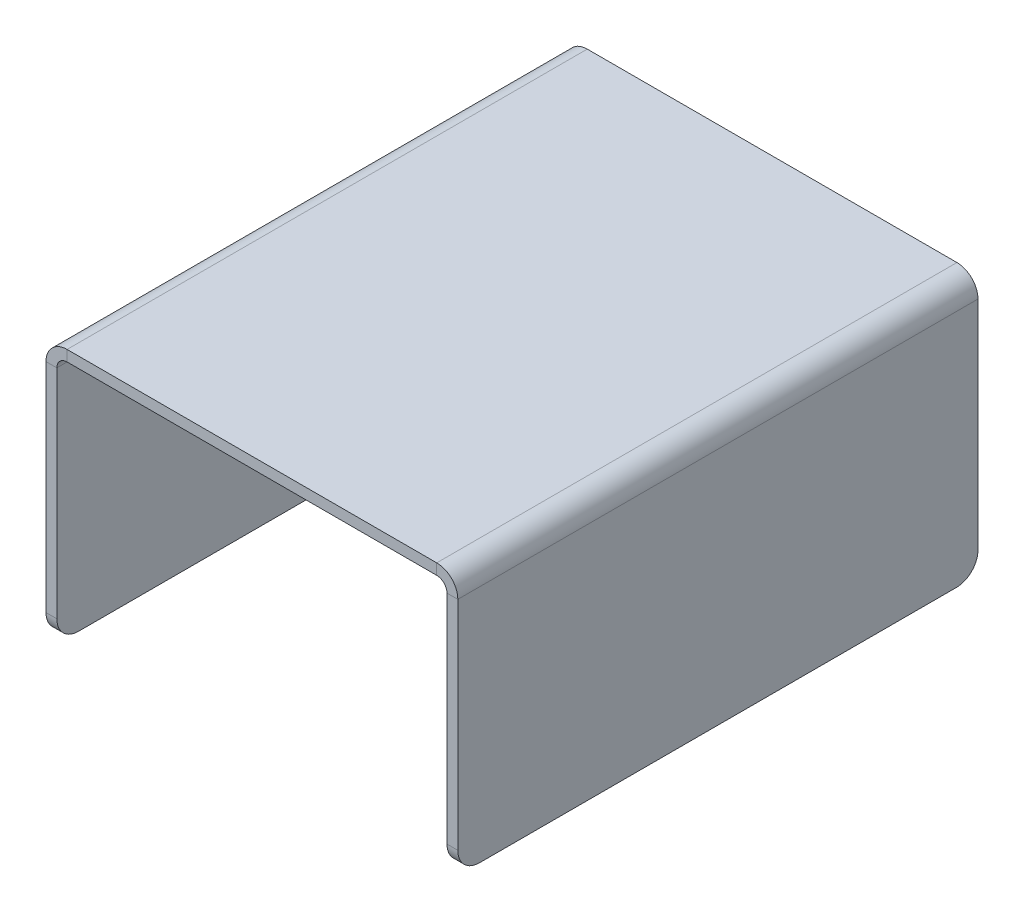
ISO-10303-21;
HEADER;
FILE_DESCRIPTION(('STEP AP214'),'2;1');
FILE_NAME('part.step','',(''),(''),'','','');
FILE_SCHEMA(('AUTOMOTIVE_DESIGN { 1 0 10303 214 1 1 1 1 }'));
ENDSEC;
DATA;
#1=APPLICATION_CONTEXT('core data for automotive mechanical design processes');
#2=APPLICATION_PROTOCOL_DEFINITION('international standard','automotive_design',2000,#1);
#3=PRODUCT_CONTEXT('',#1,'mechanical');
#4=PRODUCT('Part','Part','',(#3));
#5=PRODUCT_RELATED_PRODUCT_CATEGORY('part','',(#4));
#6=PRODUCT_DEFINITION_FORMATION('','',#4);
#7=PRODUCT_DEFINITION_CONTEXT('part definition',#1,'design');
#8=PRODUCT_DEFINITION('design','',#6,#7);
#9=PRODUCT_DEFINITION_SHAPE('','',#8);
#10=(LENGTH_UNIT() NAMED_UNIT(*) SI_UNIT(.MILLI.,.METRE.));
#11=(NAMED_UNIT(*) PLANE_ANGLE_UNIT() SI_UNIT($,.RADIAN.));
#12=(NAMED_UNIT(*) SI_UNIT($,.STERADIAN.) SOLID_ANGLE_UNIT());
#13=UNCERTAINTY_MEASURE_WITH_UNIT(LENGTH_MEASURE(1.E-05),#10,'distance_accuracy_value','');
#14=(GEOMETRIC_REPRESENTATION_CONTEXT(3) GLOBAL_UNCERTAINTY_ASSIGNED_CONTEXT((#13)) GLOBAL_UNIT_ASSIGNED_CONTEXT((#10,
#11,#12)) REPRESENTATION_CONTEXT('',''));
#15=CARTESIAN_POINT('',(0.,0.,0.));
#16=DIRECTION('',(0.,0.,1.));
#17=DIRECTION('',(1.,0.,0.));
#18=AXIS2_PLACEMENT_3D('',#15,#16,#17);
#19=CARTESIAN_POINT('',(0.,-3.175,0.));
#20=DIRECTION('',(0.,-1.,0.));
#21=DIRECTION('',(0.,0.,-1.));
#22=AXIS2_PLACEMENT_3D('',#19,#20,#21);
#23=PLANE('',#22);
#24=DIRECTION('',(1.,0.,0.));
#25=VECTOR('',#24,1.);
#26=CARTESIAN_POINT('',(-57.15,-3.175,76.2));
#27=LINE('',#26,#25);
#28=CARTESIAN_POINT('',(-54.149999904,-3.17499999999999,76.1999999999999));
#29=VERTEX_POINT('',#28);
#30=CARTESIAN_POINT('',(54.149999904,-3.175,76.2));
#31=VERTEX_POINT('',#30);
#32=EDGE_CURVE('E316',#29,#31,#27,.T.);
#33=ORIENTED_EDGE('',*,*,#32,.F.);
#34=DIRECTION('',(0.,0.,-1.));
#35=VECTOR('',#34,1.);
#36=CARTESIAN_POINT('',(-54.149999904,-3.17499999999999,-76.2));
#37=LINE('',#36,#35);
#38=CARTESIAN_POINT('',(-54.149999904,-3.17499999999999,-76.2));
#39=VERTEX_POINT('',#38);
#40=EDGE_CURVE('E234',#39,#29,#37,.F.);
#41=ORIENTED_EDGE('',*,*,#40,.F.);
#42=DIRECTION('',(-1.,0.,0.));
#43=VECTOR('',#42,1.);
#44=CARTESIAN_POINT('',(-57.15,-3.175,-76.2));
#45=LINE('',#44,#43);
#46=CARTESIAN_POINT('',(54.149999904,-3.175,-76.2));
#47=VERTEX_POINT('',#46);
#48=EDGE_CURVE('E312',#47,#39,#45,.T.);
#49=ORIENTED_EDGE('',*,*,#48,.F.);
#50=DIRECTION('',(0.,0.,1.));
#51=VECTOR('',#50,1.);
#52=CARTESIAN_POINT('',(54.149999904,-3.17499999999998,76.2));
#53=LINE('',#52,#51);
#54=EDGE_CURVE('E298',#31,#47,#53,.F.);
#55=ORIENTED_EDGE('',*,*,#54,.F.);
#56=EDGE_LOOP('',(#33,#41,#49,#55));
#57=FACE_BOUND('',#56,.T.);
#58=ADVANCED_FACE('F47',(#57),#23,.T.);
#59=CARTESIAN_POINT('',(0.,0.,0.));
#60=DIRECTION('',(0.,-1.,0.));
#61=DIRECTION('',(0.,0.,-1.));
#62=AXIS2_PLACEMENT_3D('',#59,#60,#61);
#63=PLANE('',#62);
#64=DIRECTION('',(0.,0.,-1.));
#65=VECTOR('',#64,1.);
#66=CARTESIAN_POINT('',(-54.149999904,0.,-76.2));
#67=LINE('',#66,#65);
#68=CARTESIAN_POINT('',(-54.149999904,0.,-76.2));
#69=VERTEX_POINT('',#68);
#70=CARTESIAN_POINT('',(-54.149999904,0.,76.1999999999999));
#71=VERTEX_POINT('',#70);
#72=EDGE_CURVE('E172',#69,#71,#67,.F.);
#73=ORIENTED_EDGE('',*,*,#72,.T.);
#74=DIRECTION('',(1.,0.,0.));
#75=VECTOR('',#74,1.);
#76=CARTESIAN_POINT('',(-57.15,0.,76.2));
#77=LINE('',#76,#75);
#78=CARTESIAN_POINT('',(54.149999904,0.,76.2));
#79=VERTEX_POINT('',#78);
#80=EDGE_CURVE('E317',#71,#79,#77,.T.);
#81=ORIENTED_EDGE('',*,*,#80,.T.);
#82=DIRECTION('',(0.,0.,1.));
#83=VECTOR('',#82,1.);
#84=CARTESIAN_POINT('',(54.149999904,0.,76.2));
#85=LINE('',#84,#83);
#86=CARTESIAN_POINT('',(54.149999904,0.,-76.2));
#87=VERTEX_POINT('',#86);
#88=EDGE_CURVE('E282',#79,#87,#85,.F.);
#89=ORIENTED_EDGE('',*,*,#88,.T.);
#90=DIRECTION('',(-1.,0.,0.));
#91=VECTOR('',#90,1.);
#92=CARTESIAN_POINT('',(-57.15,0.,-76.2));
#93=LINE('',#92,#91);
#94=EDGE_CURVE('E309',#87,#69,#93,.T.);
#95=ORIENTED_EDGE('',*,*,#94,.T.);
#96=EDGE_LOOP('',(#73,#81,#89,#95));
#97=FACE_BOUND('',#96,.T.);
#98=ADVANCED_FACE('F408',(#97),#63,.F.);
#99=CARTESIAN_POINT('',(-57.15,-3.175,-76.2));
#100=DIRECTION('',(0.,0.,-1.));
#101=DIRECTION('',(-1.,0.,0.));
#102=AXIS2_PLACEMENT_3D('',#99,#100,#101);
#103=PLANE('',#102);
#104=ORIENTED_EDGE('',*,*,#48,.T.);
#105=DIRECTION('',(0.,1.,0.));
#106=VECTOR('',#105,1.);
#107=CARTESIAN_POINT('',(-54.149999904,-3.17499999999999,-76.2));
#108=LINE('',#107,#106);
#109=EDGE_CURVE('E229',#39,#69,#108,.T.);
#110=ORIENTED_EDGE('',*,*,#109,.T.);
#111=ORIENTED_EDGE('',*,*,#94,.F.);
#112=DIRECTION('',(0.,1.,0.));
#113=VECTOR('',#112,1.);
#114=CARTESIAN_POINT('',(54.149999904,-3.17499999999998,-76.1999999999999));
#115=LINE('',#114,#113);
#116=EDGE_CURVE('E305',#47,#87,#115,.T.);
#117=ORIENTED_EDGE('',*,*,#116,.F.);
#118=EDGE_LOOP('',(#104,#110,#111,#117));
#119=FACE_BOUND('',#118,.T.);
#120=ADVANCED_FACE('F411',(#119),#103,.T.);
#121=CARTESIAN_POINT('',(-57.15,-3.175,76.2));
#122=DIRECTION('',(0.,0.,1.));
#123=DIRECTION('',(1.,0.,0.));
#124=AXIS2_PLACEMENT_3D('',#121,#122,#123);
#125=PLANE('',#124);
#126=DIRECTION('',(0.,1.,0.));
#127=VECTOR('',#126,1.);
#128=CARTESIAN_POINT('',(-54.149999904,-3.17499999999999,76.1999999999999));
#129=LINE('',#128,#127);
#130=EDGE_CURVE('E240',#29,#71,#129,.T.);
#131=ORIENTED_EDGE('',*,*,#130,.F.);
#132=ORIENTED_EDGE('',*,*,#32,.T.);
#133=DIRECTION('',(0.,1.,0.));
#134=VECTOR('',#133,1.);
#135=CARTESIAN_POINT('',(54.149999904,-3.17499999999998,76.2));
#136=LINE('',#135,#134);
#137=EDGE_CURVE('E290',#31,#79,#136,.T.);
#138=ORIENTED_EDGE('',*,*,#137,.T.);
#139=ORIENTED_EDGE('',*,*,#80,.F.);
#140=EDGE_LOOP('',(#131,#132,#138,#139));
#141=FACE_BOUND('',#140,.T.);
#142=ADVANCED_FACE('F406',(#141),#125,.T.);
#143=CARTESIAN_POINT('',(54.149999904,-6.17500009599999,-76.2));
#144=DIRECTION('',(0.,0.,-1.));
#145=DIRECTION('',(-1.,0.,0.));
#146=AXIS2_PLACEMENT_3D('',#143,#144,#145);
#147=PLANE('',#146);
#148=DIRECTION('',(1.,0.,0.));
#149=VECTOR('',#148,1.);
#150=CARTESIAN_POINT('',(57.15,-6.17500009599999,-76.2));
#151=LINE('',#150,#149);
#152=CARTESIAN_POINT('',(57.15,-6.17500009599998,-76.1999999999999));
#153=VERTEX_POINT('',#152);
#154=CARTESIAN_POINT('',(60.325,-6.17500009599997,-76.1999999999999));
#155=VERTEX_POINT('',#154);
#156=EDGE_CURVE('E244',#153,#155,#151,.T.);
#157=ORIENTED_EDGE('',*,*,#156,.F.);
#158=CARTESIAN_POINT('',(54.149999904,-6.17500009599999,-76.2));
#159=DIRECTION('',(0.,0.,1.));
#160=DIRECTION('',(1.,0.,0.));
#161=AXIS2_PLACEMENT_3D('',#158,#159,#160);
#162=CIRCLE('',#161,3.00000009600001);
#163=EDGE_CURVE('E294',#47,#153,#162,.F.);
#164=ORIENTED_EDGE('',*,*,#163,.F.);
#165=ORIENTED_EDGE('',*,*,#116,.T.);
#166=CARTESIAN_POINT('',(54.149999904,-6.17500009599999,-76.1999999999999));
#167=DIRECTION('',(0.,0.,1.));
#168=DIRECTION('',(1.,0.,0.));
#169=AXIS2_PLACEMENT_3D('',#166,#167,#168);
#170=CIRCLE('',#169,6.17500009600001);
#171=EDGE_CURVE('E285',#87,#155,#170,.F.);
#172=ORIENTED_EDGE('',*,*,#171,.T.);
#173=EDGE_LOOP('',(#157,#164,#165,#172));
#174=FACE_BOUND('',#173,.T.);
#175=ADVANCED_FACE('F392',(#174),#147,.T.);
#176=CARTESIAN_POINT('',(54.149999904,-6.17500009599999,76.2));
#177=DIRECTION('',(0.,0.,-1.));
#178=DIRECTION('',(-1.,0.,0.));
#179=AXIS2_PLACEMENT_3D('',#176,#177,#178);
#180=PLANE('',#179);
#181=CARTESIAN_POINT('',(54.149999904,-6.17500009599999,76.2));
#182=DIRECTION('',(0.,0.,1.));
#183=DIRECTION('',(1.,0.,0.));
#184=AXIS2_PLACEMENT_3D('',#181,#182,#183);
#185=CIRCLE('',#184,3.00000009600001);
#186=CARTESIAN_POINT('',(57.15,-6.17500009599998,76.2));
#187=VERTEX_POINT('',#186);
#188=EDGE_CURVE('E273',#187,#31,#185,.T.);
#189=ORIENTED_EDGE('',*,*,#188,.F.);
#190=DIRECTION('',(1.,0.,0.));
#191=VECTOR('',#190,1.);
#192=CARTESIAN_POINT('',(57.15,-6.17500009599998,76.2));
#193=LINE('',#192,#191);
#194=CARTESIAN_POINT('',(60.325,-6.17500009599997,76.2));
#195=VERTEX_POINT('',#194);
#196=EDGE_CURVE('E251',#187,#195,#193,.T.);
#197=ORIENTED_EDGE('',*,*,#196,.T.);
#198=CARTESIAN_POINT('',(54.149999904,-6.17500009599999,76.2));
#199=DIRECTION('',(0.,0.,1.));
#200=DIRECTION('',(1.,0.,0.));
#201=AXIS2_PLACEMENT_3D('',#198,#199,#200);
#202=CIRCLE('',#201,6.17500009600001);
#203=EDGE_CURVE('E286',#195,#79,#202,.T.);
#204=ORIENTED_EDGE('',*,*,#203,.T.);
#205=ORIENTED_EDGE('',*,*,#137,.F.);
#206=EDGE_LOOP('',(#189,#197,#204,#205));
#207=FACE_BOUND('',#206,.T.);
#208=ADVANCED_FACE('F384',(#207),#180,.F.);
#209=CARTESIAN_POINT('',(54.149999904,-6.17500009599999,76.2));
#210=DIRECTION('',(0.,0.,1.));
#211=DIRECTION('',(1.,0.,0.));
#212=AXIS2_PLACEMENT_3D('',#209,#210,#211);
#213=CYLINDRICAL_SURFACE('',#212,6.17500009600001);
#214=ORIENTED_EDGE('',*,*,#88,.F.);
#215=ORIENTED_EDGE('',*,*,#203,.F.);
#216=DIRECTION('',(0.,0.,-1.));
#217=VECTOR('',#216,1.);
#218=CARTESIAN_POINT('',(60.325,-6.17500009599997,0.));
#219=LINE('',#218,#217);
#220=EDGE_CURVE('E255',#195,#155,#219,.T.);
#221=ORIENTED_EDGE('',*,*,#220,.T.);
#222=ORIENTED_EDGE('',*,*,#171,.F.);
#223=EDGE_LOOP('',(#214,#215,#221,#222));
#224=FACE_BOUND('',#223,.T.);
#225=ADVANCED_FACE('F389',(#224),#213,.T.);
#226=CARTESIAN_POINT('',(54.149999904,-6.17500009599999,76.2));
#227=DIRECTION('',(0.,0.,1.));
#228=DIRECTION('',(1.,0.,0.));
#229=AXIS2_PLACEMENT_3D('',#226,#227,#228);
#230=CYLINDRICAL_SURFACE('',#229,3.00000009600001);
#231=ORIENTED_EDGE('',*,*,#54,.T.);
#232=ORIENTED_EDGE('',*,*,#163,.T.);
#233=DIRECTION('',(0.,0.,1.));
#234=VECTOR('',#233,1.);
#235=CARTESIAN_POINT('',(57.15,-6.17500009599999,-76.2));
#236=LINE('',#235,#234);
#237=EDGE_CURVE('E248',#153,#187,#236,.T.);
#238=ORIENTED_EDGE('',*,*,#237,.T.);
#239=ORIENTED_EDGE('',*,*,#188,.T.);
#240=EDGE_LOOP('',(#231,#232,#238,#239));
#241=FACE_BOUND('',#240,.T.);
#242=ADVANCED_FACE('F399',(#241),#230,.F.);
#243=CARTESIAN_POINT('',(60.3250000000003,-76.2,76.2));
#244=DIRECTION('',(0.,0.,-1.));
#245=DIRECTION('',(0.,1.,0.));
#246=AXIS2_PLACEMENT_3D('',#243,#244,#245);
#247=PLANE('',#246);
#248=DIRECTION('',(0.,-1.,0.));
#249=VECTOR('',#248,1.);
#250=CARTESIAN_POINT('',(57.1500000000003,-76.2,76.2));
#251=LINE('',#250,#249);
#252=CARTESIAN_POINT('',(57.1500000000002,-69.85,76.2));
#253=VERTEX_POINT('',#252);
#254=EDGE_CURVE('E262',#187,#253,#251,.T.);
#255=ORIENTED_EDGE('',*,*,#254,.T.);
#256=DIRECTION('',(-1.,0.,0.));
#257=VECTOR('',#256,1.);
#258=CARTESIAN_POINT('',(60.3250000000002,-69.85,76.2));
#259=LINE('',#258,#257);
#260=CARTESIAN_POINT('',(60.3250000000002,-69.85,76.2));
#261=VERTEX_POINT('',#260);
#262=EDGE_CURVE('E71',#253,#261,#259,.F.);
#263=ORIENTED_EDGE('',*,*,#262,.T.);
#264=DIRECTION('',(0.,-1.,0.));
#265=VECTOR('',#264,1.);
#266=CARTESIAN_POINT('',(60.3250000000003,-76.2,76.2));
#267=LINE('',#266,#265);
#268=EDGE_CURVE('E263',#195,#261,#267,.T.);
#269=ORIENTED_EDGE('',*,*,#268,.F.);
#270=ORIENTED_EDGE('',*,*,#196,.F.);
#271=EDGE_LOOP('',(#255,#263,#269,#270));
#272=FACE_BOUND('',#271,.T.);
#273=ADVANCED_FACE('F381',(#272),#247,.F.);
#274=CARTESIAN_POINT('',(60.325,-3.17499999999999,-76.2));
#275=DIRECTION('',(0.,0.,1.));
#276=DIRECTION('',(1.,0.,0.));
#277=AXIS2_PLACEMENT_3D('',#274,#275,#276);
#278=PLANE('',#277);
#279=DIRECTION('',(0.,1.,0.));
#280=VECTOR('',#279,1.);
#281=CARTESIAN_POINT('',(60.325,-3.17499999999999,-76.2));
#282=LINE('',#281,#280);
#283=CARTESIAN_POINT('',(60.3250000000002,-69.85,-76.2));
#284=VERTEX_POINT('',#283);
#285=EDGE_CURVE('E270',#284,#155,#282,.T.);
#286=ORIENTED_EDGE('',*,*,#285,.F.);
#287=DIRECTION('',(-1.,0.,0.));
#288=VECTOR('',#287,1.);
#289=CARTESIAN_POINT('',(60.3250000000002,-69.85,-76.2));
#290=LINE('',#289,#288);
#291=CARTESIAN_POINT('',(57.1500000000002,-69.85,-76.2));
#292=VERTEX_POINT('',#291);
#293=EDGE_CURVE('E11',#284,#292,#290,.T.);
#294=ORIENTED_EDGE('',*,*,#293,.T.);
#295=DIRECTION('',(0.,1.,0.));
#296=VECTOR('',#295,1.);
#297=CARTESIAN_POINT('',(57.15,-3.175,-76.2));
#298=LINE('',#297,#296);
#299=EDGE_CURVE('E267',#292,#153,#298,.T.);
#300=ORIENTED_EDGE('',*,*,#299,.T.);
#301=ORIENTED_EDGE('',*,*,#156,.T.);
#302=EDGE_LOOP('',(#286,#294,#300,#301));
#303=FACE_BOUND('',#302,.T.);
#304=ADVANCED_FACE('F395',(#303),#278,.F.);
#305=CARTESIAN_POINT('',(60.325,2.12011685424836E-13,0.));
#306=DIRECTION('',(-1.,0.,0.));
#307=DIRECTION('',(0.,-1.,0.));
#308=AXIS2_PLACEMENT_3D('',#305,#306,#307);
#309=PLANE('',#308);
#310=ORIENTED_EDGE('',*,*,#268,.T.);
#311=CARTESIAN_POINT('',(60.3250000000002,-69.85,69.85));
#312=DIRECTION('',(-1.,0.,0.));
#313=DIRECTION('',(0.,-1.,0.));
#314=AXIS2_PLACEMENT_3D('',#311,#312,#313);
#315=CIRCLE('',#314,6.35);
#316=CARTESIAN_POINT('',(60.3250000000003,-76.2,69.85));
#317=VERTEX_POINT('',#316);
#318=EDGE_CURVE('E56',#261,#317,#315,.F.);
#319=ORIENTED_EDGE('',*,*,#318,.T.);
#320=DIRECTION('',(0.,0.,-1.));
#321=VECTOR('',#320,1.);
#322=CARTESIAN_POINT('',(60.3250000000003,-76.2,-76.2));
#323=LINE('',#322,#321);
#324=CARTESIAN_POINT('',(60.3250000000003,-76.2,-69.85));
#325=VERTEX_POINT('',#324);
#326=EDGE_CURVE('E266',#317,#325,#323,.T.);
#327=ORIENTED_EDGE('',*,*,#326,.T.);
#328=CARTESIAN_POINT('',(60.3250000000002,-69.85,-69.85));
#329=DIRECTION('',(-1.,0.,0.));
#330=DIRECTION('',(0.,-1.,0.));
#331=AXIS2_PLACEMENT_3D('',#328,#329,#330);
#332=CIRCLE('',#331,6.35);
#333=EDGE_CURVE('E63',#325,#284,#332,.F.);
#334=ORIENTED_EDGE('',*,*,#333,.T.);
#335=ORIENTED_EDGE('',*,*,#285,.T.);
#336=ORIENTED_EDGE('',*,*,#220,.F.);
#337=EDGE_LOOP('',(#310,#319,#327,#334,#335,#336));
#338=FACE_BOUND('',#337,.T.);
#339=ADVANCED_FACE('F367',(#338),#309,.F.);
#340=CARTESIAN_POINT('',(57.15,2.00926232174009E-13,0.));
#341=DIRECTION('',(-1.,0.,0.));
#342=DIRECTION('',(0.,-1.,0.));
#343=AXIS2_PLACEMENT_3D('',#340,#341,#342);
#344=PLANE('',#343);
#345=DIRECTION('',(0.,0.,-1.));
#346=VECTOR('',#345,1.);
#347=CARTESIAN_POINT('',(57.1500000000003,-76.2,-76.2));
#348=LINE('',#347,#346);
#349=CARTESIAN_POINT('',(57.1500000000003,-76.2,69.85));
#350=VERTEX_POINT('',#349);
#351=CARTESIAN_POINT('',(57.1500000000003,-76.2,-69.85));
#352=VERTEX_POINT('',#351);
#353=EDGE_CURVE('E276',#350,#352,#348,.T.);
#354=ORIENTED_EDGE('',*,*,#353,.F.);
#355=CARTESIAN_POINT('',(57.1500000000002,-69.85,69.85));
#356=DIRECTION('',(-1.,0.,0.));
#357=DIRECTION('',(0.,-1.,0.));
#358=AXIS2_PLACEMENT_3D('',#355,#356,#357);
#359=CIRCLE('',#358,6.35);
#360=EDGE_CURVE('E359',#350,#253,#359,.T.);
#361=ORIENTED_EDGE('',*,*,#360,.T.);
#362=ORIENTED_EDGE('',*,*,#254,.F.);
#363=ORIENTED_EDGE('',*,*,#237,.F.);
#364=ORIENTED_EDGE('',*,*,#299,.F.);
#365=CARTESIAN_POINT('',(57.1500000000002,-69.85,-69.85));
#366=DIRECTION('',(-1.,0.,0.));
#367=DIRECTION('',(0.,-1.,0.));
#368=AXIS2_PLACEMENT_3D('',#365,#366,#367);
#369=CIRCLE('',#368,6.35);
#370=EDGE_CURVE('E356',#292,#352,#369,.T.);
#371=ORIENTED_EDGE('',*,*,#370,.T.);
#372=EDGE_LOOP('',(#354,#361,#362,#363,#364,#371));
#373=FACE_BOUND('',#372,.T.);
#374=ADVANCED_FACE('F378',(#373),#344,.T.);
#375=CARTESIAN_POINT('',(60.3250000000003,-76.2,-76.2));
#376=DIRECTION('',(0.,1.,0.));
#377=DIRECTION('',(-1.,0.,0.));
#378=AXIS2_PLACEMENT_3D('',#375,#376,#377);
#379=PLANE('',#378);
#380=ORIENTED_EDGE('',*,*,#326,.F.);
#381=DIRECTION('',(-1.,0.,0.));
#382=VECTOR('',#381,1.);
#383=CARTESIAN_POINT('',(60.3250000000003,-76.2,69.85));
#384=LINE('',#383,#382);
#385=EDGE_CURVE('E352',#317,#350,#384,.T.);
#386=ORIENTED_EDGE('',*,*,#385,.T.);
#387=ORIENTED_EDGE('',*,*,#353,.T.);
#388=DIRECTION('',(-1.,0.,0.));
#389=VECTOR('',#388,1.);
#390=CARTESIAN_POINT('',(60.3250000000003,-76.2,-69.85));
#391=LINE('',#390,#389);
#392=EDGE_CURVE('E349',#352,#325,#391,.F.);
#393=ORIENTED_EDGE('',*,*,#392,.T.);
#394=EDGE_LOOP('',(#380,#386,#387,#393));
#395=FACE_BOUND('',#394,.T.);
#396=ADVANCED_FACE('F372',(#395),#379,.F.);
#397=CARTESIAN_POINT('',(-54.149999904,-6.175000096,76.1999999999999));
#398=DIRECTION('',(0.,0.,1.));
#399=DIRECTION('',(1.,0.,0.));
#400=AXIS2_PLACEMENT_3D('',#397,#398,#399);
#401=PLANE('',#400);
#402=DIRECTION('',(-1.,0.,0.));
#403=VECTOR('',#402,1.);
#404=CARTESIAN_POINT('',(-57.15,-6.17500009599999,76.2));
#405=LINE('',#404,#403);
#406=CARTESIAN_POINT('',(-57.15,-6.17500009599999,76.1999999999999));
#407=VERTEX_POINT('',#406);
#408=CARTESIAN_POINT('',(-60.325,-6.17500009599998,76.1999999999999));
#409=VERTEX_POINT('',#408);
#410=EDGE_CURVE('E419',#407,#409,#405,.T.);
#411=ORIENTED_EDGE('',*,*,#410,.F.);
#412=CARTESIAN_POINT('',(-54.149999904,-6.175000096,76.1999999999999));
#413=DIRECTION('',(0.,0.,-1.));
#414=DIRECTION('',(-1.,0.,0.));
#415=AXIS2_PLACEMENT_3D('',#412,#413,#414);
#416=CIRCLE('',#415,3.00000009600001);
#417=EDGE_CURVE('E176',#29,#407,#416,.F.);
#418=ORIENTED_EDGE('',*,*,#417,.F.);
#419=ORIENTED_EDGE('',*,*,#130,.T.);
#420=CARTESIAN_POINT('',(-54.149999904,-6.175000096,76.1999999999999));
#421=DIRECTION('',(0.,0.,-1.));
#422=DIRECTION('',(-1.,0.,0.));
#423=AXIS2_PLACEMENT_3D('',#420,#421,#422);
#424=CIRCLE('',#423,6.17500009600001);
#425=EDGE_CURVE('E227',#71,#409,#424,.F.);
#426=ORIENTED_EDGE('',*,*,#425,.T.);
#427=EDGE_LOOP('',(#411,#418,#419,#426));
#428=FACE_BOUND('',#427,.T.);
#429=ADVANCED_FACE('F428',(#428),#401,.T.);
#430=CARTESIAN_POINT('',(-54.149999904,-6.175000096,-76.2));
#431=DIRECTION('',(0.,0.,1.));
#432=DIRECTION('',(1.,0.,0.));
#433=AXIS2_PLACEMENT_3D('',#430,#431,#432);
#434=PLANE('',#433);
#435=CARTESIAN_POINT('',(-54.149999904,-6.175000096,-76.2));
#436=DIRECTION('',(0.,0.,-1.));
#437=DIRECTION('',(-1.,0.,0.));
#438=AXIS2_PLACEMENT_3D('',#435,#436,#437);
#439=CIRCLE('',#438,3.00000009600001);
#440=CARTESIAN_POINT('',(-57.15,-6.17500009599999,-76.2));
#441=VERTEX_POINT('',#440);
#442=EDGE_CURVE('E183',#441,#39,#439,.T.);
#443=ORIENTED_EDGE('',*,*,#442,.F.);
#444=DIRECTION('',(-1.,0.,0.));
#445=VECTOR('',#444,1.);
#446=CARTESIAN_POINT('',(-57.15,-6.17500009599999,-76.2));
#447=LINE('',#446,#445);
#448=CARTESIAN_POINT('',(-60.325,-6.17500009599998,-76.2));
#449=VERTEX_POINT('',#448);
#450=EDGE_CURVE('E180',#441,#449,#447,.T.);
#451=ORIENTED_EDGE('',*,*,#450,.T.);
#452=CARTESIAN_POINT('',(-54.149999904,-6.175000096,-76.2));
#453=DIRECTION('',(0.,0.,-1.));
#454=DIRECTION('',(-1.,0.,0.));
#455=AXIS2_PLACEMENT_3D('',#452,#453,#454);
#456=CIRCLE('',#455,6.17500009600001);
#457=EDGE_CURVE('E165',#449,#69,#456,.T.);
#458=ORIENTED_EDGE('',*,*,#457,.T.);
#459=ORIENTED_EDGE('',*,*,#109,.F.);
#460=EDGE_LOOP('',(#443,#451,#458,#459));
#461=FACE_BOUND('',#460,.T.);
#462=ADVANCED_FACE('F181',(#461),#434,.F.);
#463=CARTESIAN_POINT('',(-54.149999904,-6.175000096,-76.2));
#464=DIRECTION('',(0.,0.,-1.));
#465=DIRECTION('',(-1.,0.,0.));
#466=AXIS2_PLACEMENT_3D('',#463,#464,#465);
#467=CYLINDRICAL_SURFACE('',#466,6.17500009600001);
#468=ORIENTED_EDGE('',*,*,#72,.F.);
#469=ORIENTED_EDGE('',*,*,#457,.F.);
#470=DIRECTION('',(0.,0.,1.));
#471=VECTOR('',#470,1.);
#472=CARTESIAN_POINT('',(-60.325,-6.17500009599998,0.));
#473=LINE('',#472,#471);
#474=EDGE_CURVE('E170',#449,#409,#473,.T.);
#475=ORIENTED_EDGE('',*,*,#474,.T.);
#476=ORIENTED_EDGE('',*,*,#425,.F.);
#477=EDGE_LOOP('',(#468,#469,#475,#476));
#478=FACE_BOUND('',#477,.T.);
#479=ADVANCED_FACE('F167',(#478),#467,.T.);
#480=CARTESIAN_POINT('',(-54.149999904,-6.175000096,-76.2));
#481=DIRECTION('',(0.,0.,-1.));
#482=DIRECTION('',(-1.,0.,0.));
#483=AXIS2_PLACEMENT_3D('',#480,#481,#482);
#484=CYLINDRICAL_SURFACE('',#483,3.00000009600001);
#485=ORIENTED_EDGE('',*,*,#40,.T.);
#486=ORIENTED_EDGE('',*,*,#417,.T.);
#487=DIRECTION('',(0.,0.,-1.));
#488=VECTOR('',#487,1.);
#489=CARTESIAN_POINT('',(-57.15,-6.17500009599999,76.2));
#490=LINE('',#489,#488);
#491=EDGE_CURVE('E189',#407,#441,#490,.T.);
#492=ORIENTED_EDGE('',*,*,#491,.T.);
#493=ORIENTED_EDGE('',*,*,#442,.T.);
#494=EDGE_LOOP('',(#485,#486,#492,#493));
#495=FACE_BOUND('',#494,.T.);
#496=ADVANCED_FACE('F413',(#495),#484,.F.);
#497=CARTESIAN_POINT('',(-60.3250000000003,-76.2,-76.2));
#498=DIRECTION('',(0.,0.,1.));
#499=DIRECTION('',(0.,-1.,0.));
#500=AXIS2_PLACEMENT_3D('',#497,#498,#499);
#501=PLANE('',#500);
#502=DIRECTION('',(0.,-1.,0.));
#503=VECTOR('',#502,1.);
#504=CARTESIAN_POINT('',(-57.1500000000003,-76.2,-76.2));
#505=LINE('',#504,#503);
#506=CARTESIAN_POINT('',(-57.1500000000002,-69.85,-76.2));
#507=VERTEX_POINT('',#506);
#508=EDGE_CURVE('E200',#441,#507,#505,.T.);
#509=ORIENTED_EDGE('',*,*,#508,.T.);
#510=DIRECTION('',(1.,0.,0.));
#511=VECTOR('',#510,1.);
#512=CARTESIAN_POINT('',(-60.3250000000002,-69.85,-76.2));
#513=LINE('',#512,#511);
#514=CARTESIAN_POINT('',(-60.3250000000002,-69.85,-76.2));
#515=VERTEX_POINT('',#514);
#516=EDGE_CURVE('E204',#507,#515,#513,.F.);
#517=ORIENTED_EDGE('',*,*,#516,.T.);
#518=DIRECTION('',(0.,-1.,0.));
#519=VECTOR('',#518,1.);
#520=CARTESIAN_POINT('',(-60.3250000000003,-76.2,-76.2));
#521=LINE('',#520,#519);
#522=EDGE_CURVE('E195',#449,#515,#521,.T.);
#523=ORIENTED_EDGE('',*,*,#522,.F.);
#524=ORIENTED_EDGE('',*,*,#450,.F.);
#525=EDGE_LOOP('',(#509,#517,#523,#524));
#526=FACE_BOUND('',#525,.T.);
#527=ADVANCED_FACE('F202',(#526),#501,.F.);
#528=CARTESIAN_POINT('',(-60.325,-3.17499999999999,76.2));
#529=DIRECTION('',(0.,0.,-1.));
#530=DIRECTION('',(-1.,0.,0.));
#531=AXIS2_PLACEMENT_3D('',#528,#529,#530);
#532=PLANE('',#531);
#533=DIRECTION('',(0.,1.,0.));
#534=VECTOR('',#533,1.);
#535=CARTESIAN_POINT('',(-60.325,-3.17499999999999,76.2));
#536=LINE('',#535,#534);
#537=CARTESIAN_POINT('',(-60.3250000000002,-69.85,76.2));
#538=VERTEX_POINT('',#537);
#539=EDGE_CURVE('E198',#538,#409,#536,.T.);
#540=ORIENTED_EDGE('',*,*,#539,.F.);
#541=DIRECTION('',(1.,0.,0.));
#542=VECTOR('',#541,1.);
#543=CARTESIAN_POINT('',(-60.3250000000002,-69.85,76.2));
#544=LINE('',#543,#542);
#545=CARTESIAN_POINT('',(-57.1500000000002,-69.85,76.2));
#546=VERTEX_POINT('',#545);
#547=EDGE_CURVE('E320',#538,#546,#544,.T.);
#548=ORIENTED_EDGE('',*,*,#547,.T.);
#549=DIRECTION('',(0.,1.,0.));
#550=VECTOR('',#549,1.);
#551=CARTESIAN_POINT('',(-57.15,-3.175,76.2));
#552=LINE('',#551,#550);
#553=EDGE_CURVE('E207',#546,#407,#552,.T.);
#554=ORIENTED_EDGE('',*,*,#553,.T.);
#555=ORIENTED_EDGE('',*,*,#410,.T.);
#556=EDGE_LOOP('',(#540,#548,#554,#555));
#557=FACE_BOUND('',#556,.T.);
#558=ADVANCED_FACE('F425',(#557),#532,.F.);
#559=CARTESIAN_POINT('',(-60.325,2.12011685424836E-13,0.));
#560=DIRECTION('',(1.,0.,0.));
#561=DIRECTION('',(0.,1.,0.));
#562=AXIS2_PLACEMENT_3D('',#559,#560,#561);
#563=PLANE('',#562);
#564=DIRECTION('',(0.,0.,1.));
#565=VECTOR('',#564,1.);
#566=CARTESIAN_POINT('',(-60.3250000000003,-76.2,76.2));
#567=LINE('',#566,#565);
#568=CARTESIAN_POINT('',(-60.3250000000003,-76.2,-69.85));
#569=VERTEX_POINT('',#568);
#570=CARTESIAN_POINT('',(-60.3250000000003,-76.2,69.85));
#571=VERTEX_POINT('',#570);
#572=EDGE_CURVE('E206',#569,#571,#567,.T.);
#573=ORIENTED_EDGE('',*,*,#572,.T.);
#574=CARTESIAN_POINT('',(-60.3250000000002,-69.85,69.85));
#575=DIRECTION('',(1.,0.,0.));
#576=DIRECTION('',(0.,1.,0.));
#577=AXIS2_PLACEMENT_3D('',#574,#575,#576);
#578=CIRCLE('',#577,6.35);
#579=EDGE_CURVE('E344',#571,#538,#578,.F.);
#580=ORIENTED_EDGE('',*,*,#579,.T.);
#581=ORIENTED_EDGE('',*,*,#539,.T.);
#582=ORIENTED_EDGE('',*,*,#474,.F.);
#583=ORIENTED_EDGE('',*,*,#522,.T.);
#584=CARTESIAN_POINT('',(-60.3250000000002,-69.85,-69.85));
#585=DIRECTION('',(1.,0.,0.));
#586=DIRECTION('',(0.,1.,0.));
#587=AXIS2_PLACEMENT_3D('',#584,#585,#586);
#588=CIRCLE('',#587,6.35);
#589=EDGE_CURVE('E342',#515,#569,#588,.F.);
#590=ORIENTED_EDGE('',*,*,#589,.T.);
#591=EDGE_LOOP('',(#573,#580,#581,#582,#583,#590));
#592=FACE_BOUND('',#591,.T.);
#593=ADVANCED_FACE('F194',(#592),#563,.F.);
#594=CARTESIAN_POINT('',(-57.15,2.00926232174009E-13,0.));
#595=DIRECTION('',(1.,0.,0.));
#596=DIRECTION('',(0.,1.,0.));
#597=AXIS2_PLACEMENT_3D('',#594,#595,#596);
#598=PLANE('',#597);
#599=ORIENTED_EDGE('',*,*,#553,.F.);
#600=CARTESIAN_POINT('',(-57.1500000000002,-69.85,69.85));
#601=DIRECTION('',(1.,0.,0.));
#602=DIRECTION('',(0.,1.,0.));
#603=AXIS2_PLACEMENT_3D('',#600,#601,#602);
#604=CIRCLE('',#603,6.35);
#605=CARTESIAN_POINT('',(-57.1500000000003,-76.2,69.85));
#606=VERTEX_POINT('',#605);
#607=EDGE_CURVE('E332',#546,#606,#604,.T.);
#608=ORIENTED_EDGE('',*,*,#607,.T.);
#609=DIRECTION('',(0.,0.,1.));
#610=VECTOR('',#609,1.);
#611=CARTESIAN_POINT('',(-57.1500000000003,-76.2,76.2));
#612=LINE('',#611,#610);
#613=CARTESIAN_POINT('',(-57.1500000000003,-76.2,-69.85));
#614=VERTEX_POINT('',#613);
#615=EDGE_CURVE('E214',#614,#606,#612,.T.);
#616=ORIENTED_EDGE('',*,*,#615,.F.);
#617=CARTESIAN_POINT('',(-57.1500000000002,-69.85,-69.85));
#618=DIRECTION('',(1.,0.,0.));
#619=DIRECTION('',(0.,1.,0.));
#620=AXIS2_PLACEMENT_3D('',#617,#618,#619);
#621=CIRCLE('',#620,6.35);
#622=EDGE_CURVE('E329',#614,#507,#621,.T.);
#623=ORIENTED_EDGE('',*,*,#622,.T.);
#624=ORIENTED_EDGE('',*,*,#508,.F.);
#625=ORIENTED_EDGE('',*,*,#491,.F.);
#626=EDGE_LOOP('',(#599,#608,#616,#623,#624,#625));
#627=FACE_BOUND('',#626,.T.);
#628=ADVANCED_FACE('F486',(#627),#598,.T.);
#629=CARTESIAN_POINT('',(-60.3250000000003,-76.2,76.2));
#630=DIRECTION('',(0.,1.,0.));
#631=DIRECTION('',(-1.,0.,0.));
#632=AXIS2_PLACEMENT_3D('',#629,#630,#631);
#633=PLANE('',#632);
#634=ORIENTED_EDGE('',*,*,#615,.T.);
#635=DIRECTION('',(1.,0.,0.));
#636=VECTOR('',#635,1.);
#637=CARTESIAN_POINT('',(-60.3250000000003,-76.2,69.85));
#638=LINE('',#637,#636);
#639=EDGE_CURVE('E339',#606,#571,#638,.F.);
#640=ORIENTED_EDGE('',*,*,#639,.T.);
#641=ORIENTED_EDGE('',*,*,#572,.F.);
#642=DIRECTION('',(1.,0.,0.));
#643=VECTOR('',#642,1.);
#644=CARTESIAN_POINT('',(-60.3250000000003,-76.2,-69.85));
#645=LINE('',#644,#643);
#646=EDGE_CURVE('E335',#569,#614,#645,.T.);
#647=ORIENTED_EDGE('',*,*,#646,.T.);
#648=EDGE_LOOP('',(#634,#640,#641,#647));
#649=FACE_BOUND('',#648,.T.);
#650=ADVANCED_FACE('F455',(#649),#633,.F.);
#651=CARTESIAN_POINT('',(-60.3250000000002,-69.85,69.85));
#652=DIRECTION('',(1.,0.,0.));
#653=DIRECTION('',(0.,1.,0.));
#654=AXIS2_PLACEMENT_3D('',#651,#652,#653);
#655=CYLINDRICAL_SURFACE('',#654,6.35);
#656=ORIENTED_EDGE('',*,*,#579,.F.);
#657=ORIENTED_EDGE('',*,*,#639,.F.);
#658=ORIENTED_EDGE('',*,*,#607,.F.);
#659=ORIENTED_EDGE('',*,*,#547,.F.);
#660=EDGE_LOOP('',(#656,#657,#658,#659));
#661=FACE_BOUND('',#660,.T.);
#662=ADVANCED_FACE('F451',(#661),#655,.T.);
#663=CARTESIAN_POINT('',(-60.3250000000002,-69.85,-69.85));
#664=DIRECTION('',(1.,0.,0.));
#665=DIRECTION('',(0.,1.,0.));
#666=AXIS2_PLACEMENT_3D('',#663,#664,#665);
#667=CYLINDRICAL_SURFACE('',#666,6.35);
#668=ORIENTED_EDGE('',*,*,#589,.F.);
#669=ORIENTED_EDGE('',*,*,#516,.F.);
#670=ORIENTED_EDGE('',*,*,#622,.F.);
#671=ORIENTED_EDGE('',*,*,#646,.F.);
#672=EDGE_LOOP('',(#668,#669,#670,#671));
#673=FACE_BOUND('',#672,.T.);
#674=ADVANCED_FACE('F454',(#673),#667,.T.);
#675=CARTESIAN_POINT('',(60.3250000000002,-69.85,69.85));
#676=DIRECTION('',(-1.,0.,0.));
#677=DIRECTION('',(0.,-1.,0.));
#678=AXIS2_PLACEMENT_3D('',#675,#676,#677);
#679=CYLINDRICAL_SURFACE('',#678,6.35);
#680=ORIENTED_EDGE('',*,*,#318,.F.);
#681=ORIENTED_EDGE('',*,*,#262,.F.);
#682=ORIENTED_EDGE('',*,*,#360,.F.);
#683=ORIENTED_EDGE('',*,*,#385,.F.);
#684=EDGE_LOOP('',(#680,#681,#682,#683));
#685=FACE_BOUND('',#684,.T.);
#686=ADVANCED_FACE('F375',(#685),#679,.T.);
#687=CARTESIAN_POINT('',(60.3250000000002,-69.85,-69.85));
#688=DIRECTION('',(-1.,0.,0.));
#689=DIRECTION('',(0.,-1.,0.));
#690=AXIS2_PLACEMENT_3D('',#687,#688,#689);
#691=CYLINDRICAL_SURFACE('',#690,6.35);
#692=ORIENTED_EDGE('',*,*,#333,.F.);
#693=ORIENTED_EDGE('',*,*,#392,.F.);
#694=ORIENTED_EDGE('',*,*,#370,.F.);
#695=ORIENTED_EDGE('',*,*,#293,.F.);
#696=EDGE_LOOP('',(#692,#693,#694,#695));
#697=FACE_BOUND('',#696,.T.);
#698=ADVANCED_FACE('F49',(#697),#691,.T.);
#699=CLOSED_SHELL('',(#58,#98,#120,#142,#175,#208,#225,#242,#273,#304,#339,#374,#396,#429,#462,
#479,#496,#527,#558,#593,#628,#650,#662,#674,#686,#698));
#700=MANIFOLD_SOLID_BREP('B2',#699);
#701=ADVANCED_BREP_SHAPE_REPRESENTATION('',(#18,#700),#14);
#702=SHAPE_DEFINITION_REPRESENTATION(#9,#701);
ENDSEC;
END-ISO-10303-21;
